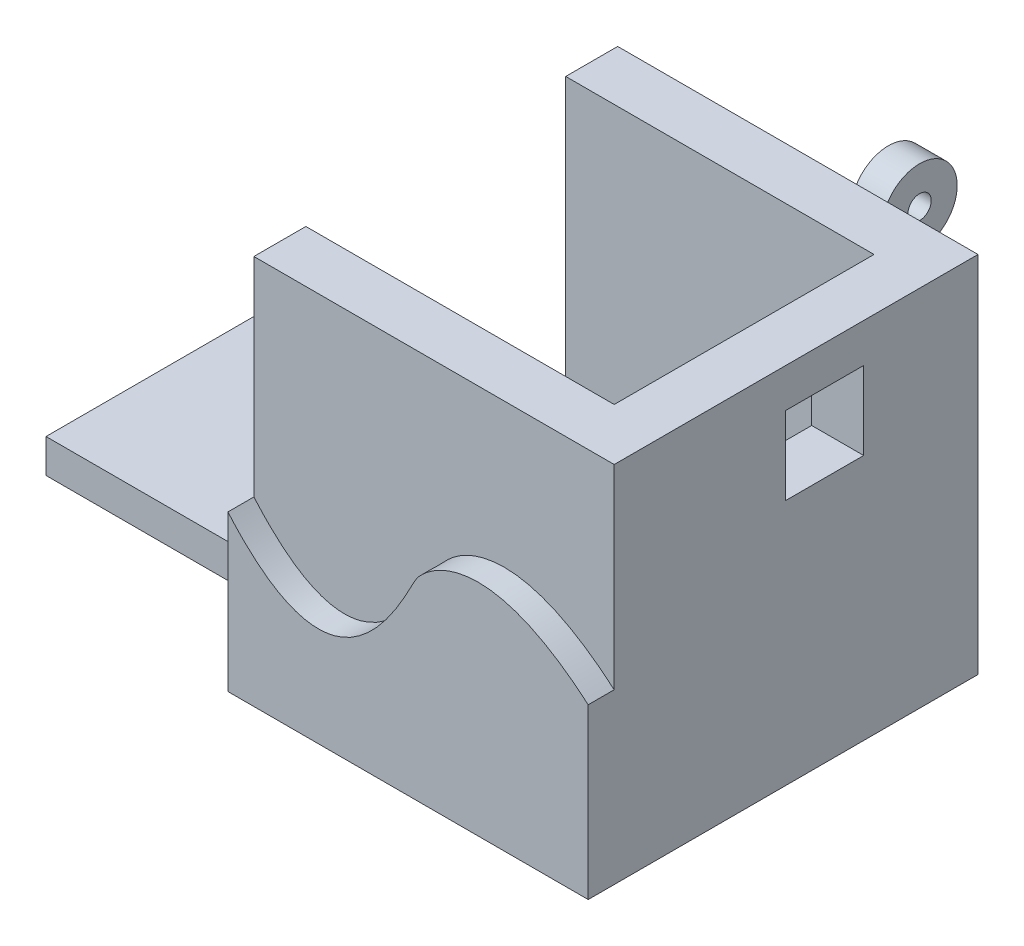
ISO-10303-21;
HEADER;
FILE_DESCRIPTION(('STEP AP214'),'2;1');
FILE_NAME('part.step','',(''),(''),'','','');
FILE_SCHEMA(('AUTOMOTIVE_DESIGN { 1 0 10303 214 1 1 1 1 }'));
ENDSEC;
DATA;
#1=APPLICATION_CONTEXT('core data for automotive mechanical design processes');
#2=APPLICATION_PROTOCOL_DEFINITION('international standard','automotive_design',2000,#1);
#3=PRODUCT_CONTEXT('',#1,'mechanical');
#4=PRODUCT('Part','Part','',(#3));
#5=PRODUCT_RELATED_PRODUCT_CATEGORY('part','',(#4));
#6=PRODUCT_DEFINITION_FORMATION('','',#4);
#7=PRODUCT_DEFINITION_CONTEXT('part definition',#1,'design');
#8=PRODUCT_DEFINITION('design','',#6,#7);
#9=PRODUCT_DEFINITION_SHAPE('','',#8);
#10=(LENGTH_UNIT() NAMED_UNIT(*) SI_UNIT(.MILLI.,.METRE.));
#11=(NAMED_UNIT(*) PLANE_ANGLE_UNIT() SI_UNIT($,.RADIAN.));
#12=(NAMED_UNIT(*) SI_UNIT($,.STERADIAN.) SOLID_ANGLE_UNIT());
#13=UNCERTAINTY_MEASURE_WITH_UNIT(LENGTH_MEASURE(1.E-05),#10,'distance_accuracy_value','');
#14=(GEOMETRIC_REPRESENTATION_CONTEXT(3) GLOBAL_UNCERTAINTY_ASSIGNED_CONTEXT((#13)) GLOBAL_UNIT_ASSIGNED_CONTEXT((#10,
#11,#12)) REPRESENTATION_CONTEXT('',''));
#15=CARTESIAN_POINT('',(0.,0.,0.));
#16=DIRECTION('',(0.,0.,1.));
#17=DIRECTION('',(1.,0.,0.));
#18=AXIS2_PLACEMENT_3D('',#15,#16,#17);
#19=CARTESIAN_POINT('',(-69.33,140.,70.));
#20=DIRECTION('',(0.,0.,-1.));
#21=DIRECTION('',(-1.,0.,0.));
#22=AXIS2_PLACEMENT_3D('',#19,#20,#21);
#23=PLANE('',#22);
#24=CARTESIAN_POINT('',(69.3300000000001,64.9320580308301,70.));
#25=CARTESIAN_POINT('',(32.0758163254666,96.8761575932816,70.));
#26=CARTESIAN_POINT('',(5.66249098280974,78.8870594514356,70.));
#27=CARTESIAN_POINT('',(-7.37035284858875,53.3024772486336,70.));
#28=CARTESIAN_POINT('',(-30.324326288878,14.7238156268719,70.));
#29=CARTESIAN_POINT('',(-69.33,59.86,70.));
#30=B_SPLINE_CURVE_WITH_KNOTS('',3,(#24,#25,#26,#27,#28,#29),.UNSPECIFIED.,.F.,.F.,(4,1,1,4),
(0.,0.200150693882502,0.240865393158399,1.),.UNSPECIFIED.);
#31=CARTESIAN_POINT('',(69.33,64.9320580308301,70.));
#32=VERTEX_POINT('',#31);
#33=CARTESIAN_POINT('',(-69.33,59.86,70.));
#34=VERTEX_POINT('',#33);
#35=EDGE_CURVE('E219',#32,#34,#30,.T.);
#36=ORIENTED_EDGE('',*,*,#35,.F.);
#37=DIRECTION('',(0.,-1.,0.));
#38=VECTOR('',#37,1.);
#39=CARTESIAN_POINT('',(69.33,140.,70.));
#40=LINE('',#39,#38);
#41=CARTESIAN_POINT('',(69.33,140.,70.));
#42=VERTEX_POINT('',#41);
#43=EDGE_CURVE('E435',#42,#32,#40,.T.);
#44=ORIENTED_EDGE('',*,*,#43,.F.);
#45=DIRECTION('',(1.,0.,0.));
#46=VECTOR('',#45,1.);
#47=CARTESIAN_POINT('',(-69.33,140.,70.));
#48=LINE('',#47,#46);
#49=CARTESIAN_POINT('',(-69.33,140.,70.));
#50=VERTEX_POINT('',#49);
#51=EDGE_CURVE('E433',#50,#42,#48,.T.);
#52=ORIENTED_EDGE('',*,*,#51,.F.);
#53=DIRECTION('',(0.,-1.,0.));
#54=VECTOR('',#53,1.);
#55=CARTESIAN_POINT('',(-69.33,140.,70.));
#56=LINE('',#55,#54);
#57=EDGE_CURVE('E442',#50,#34,#56,.T.);
#58=ORIENTED_EDGE('',*,*,#57,.T.);
#59=EDGE_LOOP('',(#36,#44,#52,#58));
#60=FACE_BOUND('',#59,.T.);
#61=ADVANCED_FACE('F39',(#60),#23,.F.);
#62=CARTESIAN_POINT('',(-69.33,140.,-70.));
#63=DIRECTION('',(0.,0.,1.));
#64=DIRECTION('',(1.,0.,0.));
#65=AXIS2_PLACEMENT_3D('',#62,#63,#64);
#66=PLANE('',#65);
#67=DIRECTION('',(-1.,0.,0.));
#68=VECTOR('',#67,1.);
#69=CARTESIAN_POINT('',(-69.33,0.,-70.));
#70=LINE('',#69,#68);
#71=CARTESIAN_POINT('',(69.33,0.,-70.));
#72=VERTEX_POINT('',#71);
#73=CARTESIAN_POINT('',(-69.33,0.,-70.));
#74=VERTEX_POINT('',#73);
#75=EDGE_CURVE('E318',#72,#74,#70,.T.);
#76=ORIENTED_EDGE('',*,*,#75,.T.);
#77=DIRECTION('',(0.,-1.,0.));
#78=VECTOR('',#77,1.);
#79=CARTESIAN_POINT('',(-69.33,140.,-70.));
#80=LINE('',#79,#78);
#81=CARTESIAN_POINT('',(-69.33,140.,-70.));
#82=VERTEX_POINT('',#81);
#83=EDGE_CURVE('E47',#82,#74,#80,.T.);
#84=ORIENTED_EDGE('',*,*,#83,.F.);
#85=DIRECTION('',(-1.,0.,0.));
#86=VECTOR('',#85,1.);
#87=CARTESIAN_POINT('',(-69.33,140.,-70.));
#88=LINE('',#87,#86);
#89=CARTESIAN_POINT('',(69.33,140.,-70.));
#90=VERTEX_POINT('',#89);
#91=EDGE_CURVE('E426',#90,#82,#88,.T.);
#92=ORIENTED_EDGE('',*,*,#91,.F.);
#93=DIRECTION('',(0.,-1.,0.));
#94=VECTOR('',#93,1.);
#95=CARTESIAN_POINT('',(69.33,140.,-70.));
#96=LINE('',#95,#94);
#97=EDGE_CURVE('E12',#90,#72,#96,.T.);
#98=ORIENTED_EDGE('',*,*,#97,.T.);
#99=EDGE_LOOP('',(#76,#84,#92,#98));
#100=FACE_BOUND('',#99,.T.);
#101=DIRECTION('',(1.,0.,0.));
#102=VECTOR('',#101,1.);
#103=CARTESIAN_POINT('',(22.33,139.330471622785,-70.));
#104=LINE('',#103,#102);
#105=CARTESIAN_POINT('',(34.33,139.330471622785,-70.));
#106=VERTEX_POINT('',#105);
#107=CARTESIAN_POINT('',(22.33,139.330471622785,-70.));
#108=VERTEX_POINT('',#107);
#109=EDGE_CURVE('E323',#106,#108,#104,.F.);
#110=ORIENTED_EDGE('',*,*,#109,.T.);
#111=DIRECTION('',(0.,1.,0.));
#112=VECTOR('',#111,1.);
#113=CARTESIAN_POINT('',(22.33,132.,-70.));
#114=LINE('',#113,#112);
#115=CARTESIAN_POINT('',(22.33,120.,-70.));
#116=VERTEX_POINT('',#115);
#117=EDGE_CURVE('E326',#116,#108,#114,.T.);
#118=ORIENTED_EDGE('',*,*,#117,.F.);
#119=DIRECTION('',(-1.,0.,0.));
#120=VECTOR('',#119,1.);
#121=CARTESIAN_POINT('',(34.33,120.,-70.));
#122=LINE('',#121,#120);
#123=CARTESIAN_POINT('',(34.33,120.,-70.));
#124=VERTEX_POINT('',#123);
#125=EDGE_CURVE('E346',#124,#116,#122,.T.);
#126=ORIENTED_EDGE('',*,*,#125,.F.);
#127=DIRECTION('',(0.,-1.,0.));
#128=VECTOR('',#127,1.);
#129=CARTESIAN_POINT('',(34.33,132.,-70.));
#130=LINE('',#129,#128);
#131=EDGE_CURVE('E328',#106,#124,#130,.T.);
#132=ORIENTED_EDGE('',*,*,#131,.F.);
#133=EDGE_LOOP('',(#110,#118,#126,#132));
#134=FACE_BOUND('',#133,.T.);
#135=ADVANCED_FACE('F307',(#100,#134),#66,.F.);
#136=CARTESIAN_POINT('',(-69.33,140.,-70.));
#137=DIRECTION('',(1.,0.,0.));
#138=DIRECTION('',(0.,0.,-1.));
#139=AXIS2_PLACEMENT_3D('',#136,#137,#138);
#140=PLANE('',#139);
#141=DIRECTION('',(0.,0.,1.));
#142=VECTOR('',#141,1.);
#143=CARTESIAN_POINT('',(-69.33,30.,-50.));
#144=LINE('',#143,#142);
#145=CARTESIAN_POINT('',(-69.33,30.,-50.));
#146=VERTEX_POINT('',#145);
#147=CARTESIAN_POINT('',(-69.33,30.,50.));
#148=VERTEX_POINT('',#147);
#149=EDGE_CURVE('E394',#146,#148,#144,.T.);
#150=ORIENTED_EDGE('',*,*,#149,.F.);
#151=DIRECTION('',(0.,1.,0.));
#152=VECTOR('',#151,1.);
#153=CARTESIAN_POINT('',(-69.33,30.,-50.));
#154=LINE('',#153,#152);
#155=CARTESIAN_POINT('',(-69.33,140.,-50.));
#156=VERTEX_POINT('',#155);
#157=EDGE_CURVE('E414',#146,#156,#154,.T.);
#158=ORIENTED_EDGE('',*,*,#157,.T.);
#159=DIRECTION('',(0.,0.,1.));
#160=VECTOR('',#159,1.);
#161=CARTESIAN_POINT('',(-69.33,140.,-70.));
#162=LINE('',#161,#160);
#163=EDGE_CURVE('E430',#82,#156,#162,.T.);
#164=ORIENTED_EDGE('',*,*,#163,.F.);
#165=ORIENTED_EDGE('',*,*,#83,.T.);
#166=DIRECTION('',(0.,0.,1.));
#167=VECTOR('',#166,1.);
#168=CARTESIAN_POINT('',(-69.33,0.,-70.));
#169=LINE('',#168,#167);
#170=CARTESIAN_POINT('',(-69.33,0.,80.));
#171=VERTEX_POINT('',#170);
#172=EDGE_CURVE('E427',#74,#171,#169,.T.);
#173=ORIENTED_EDGE('',*,*,#172,.T.);
#174=DIRECTION('',(0.,-1.,0.));
#175=VECTOR('',#174,1.);
#176=CARTESIAN_POINT('',(-69.33,0.,80.));
#177=LINE('',#176,#175);
#178=CARTESIAN_POINT('',(-69.33,59.86,80.));
#179=VERTEX_POINT('',#178);
#180=EDGE_CURVE('E226',#179,#171,#177,.T.);
#181=ORIENTED_EDGE('',*,*,#180,.F.);
#182=DIRECTION('',(0.,0.,-1.));
#183=VECTOR('',#182,1.);
#184=CARTESIAN_POINT('',(-69.33,59.86,80.));
#185=LINE('',#184,#183);
#186=EDGE_CURVE('E466',#179,#34,#185,.T.);
#187=ORIENTED_EDGE('',*,*,#186,.T.);
#188=ORIENTED_EDGE('',*,*,#57,.F.);
#189=CARTESIAN_POINT('',(-69.33,140.,50.));
#190=VERTEX_POINT('',#189);
#191=EDGE_CURVE('E429',#190,#50,#162,.T.);
#192=ORIENTED_EDGE('',*,*,#191,.F.);
#193=DIRECTION('',(0.,1.,0.));
#194=VECTOR('',#193,1.);
#195=CARTESIAN_POINT('',(-69.33,30.,50.));
#196=LINE('',#195,#194);
#197=EDGE_CURVE('E407',#148,#190,#196,.T.);
#198=ORIENTED_EDGE('',*,*,#197,.F.);
#199=EDGE_LOOP('',(#150,#158,#164,#165,#173,#181,#187,#188,#192,#198));
#200=FACE_BOUND('',#199,.T.);
#201=DIRECTION('',(0.,-1.,0.));
#202=VECTOR('',#201,1.);
#203=CARTESIAN_POINT('',(-69.33,20.,-50.));
#204=LINE('',#203,#202);
#205=CARTESIAN_POINT('',(-69.33,20.,-50.));
#206=VERTEX_POINT('',#205);
#207=CARTESIAN_POINT('',(-69.33,7.00000000000001,-50.));
#208=VERTEX_POINT('',#207);
#209=EDGE_CURVE('E360',#206,#208,#204,.T.);
#210=ORIENTED_EDGE('',*,*,#209,.F.);
#211=DIRECTION('',(0.,0.,-1.));
#212=VECTOR('',#211,1.);
#213=CARTESIAN_POINT('',(-69.33,20.,-50.));
#214=LINE('',#213,#212);
#215=CARTESIAN_POINT('',(-69.33,20.,50.));
#216=VERTEX_POINT('',#215);
#217=EDGE_CURVE('E365',#216,#206,#214,.T.);
#218=ORIENTED_EDGE('',*,*,#217,.F.);
#219=DIRECTION('',(0.,1.,0.));
#220=VECTOR('',#219,1.);
#221=CARTESIAN_POINT('',(-69.33,20.,50.));
#222=LINE('',#221,#220);
#223=CARTESIAN_POINT('',(-69.33,7.00000000000001,50.));
#224=VERTEX_POINT('',#223);
#225=EDGE_CURVE('E377',#224,#216,#222,.T.);
#226=ORIENTED_EDGE('',*,*,#225,.F.);
#227=DIRECTION('',(0.,0.,1.));
#228=VECTOR('',#227,1.);
#229=CARTESIAN_POINT('',(-69.33,7.,-50.));
#230=LINE('',#229,#228);
#231=EDGE_CURVE('E374',#208,#224,#230,.T.);
#232=ORIENTED_EDGE('',*,*,#231,.F.);
#233=EDGE_LOOP('',(#210,#218,#226,#232));
#234=FACE_BOUND('',#233,.T.);
#235=ADVANCED_FACE('F309',(#200,#234),#140,.F.);
#236=CARTESIAN_POINT('',(69.33,140.,-70.));
#237=DIRECTION('',(-1.,0.,0.));
#238=DIRECTION('',(0.,0.,1.));
#239=AXIS2_PLACEMENT_3D('',#236,#237,#238);
#240=PLANE('',#239);
#241=DIRECTION('',(0.,0.,1.));
#242=VECTOR('',#241,1.);
#243=CARTESIAN_POINT('',(69.33,95.,-70.));
#244=LINE('',#243,#242);
#245=CARTESIAN_POINT('',(69.33,95.,-26.));
#246=VERTEX_POINT('',#245);
#247=CARTESIAN_POINT('',(69.33,95.,3.99999999999999));
#248=VERTEX_POINT('',#247);
#249=EDGE_CURVE('E213',#246,#248,#244,.T.);
#250=ORIENTED_EDGE('',*,*,#249,.T.);
#251=DIRECTION('',(0.,1.,0.));
#252=VECTOR('',#251,1.);
#253=CARTESIAN_POINT('',(69.33,140.,3.99999999999999));
#254=LINE('',#253,#252);
#255=CARTESIAN_POINT('',(69.33,125.,3.99999999999999));
#256=VERTEX_POINT('',#255);
#257=EDGE_CURVE('E216',#248,#256,#254,.T.);
#258=ORIENTED_EDGE('',*,*,#257,.T.);
#259=DIRECTION('',(0.,0.,-1.));
#260=VECTOR('',#259,1.);
#261=CARTESIAN_POINT('',(69.33,125.,-70.));
#262=LINE('',#261,#260);
#263=CARTESIAN_POINT('',(69.33,125.,-26.));
#264=VERTEX_POINT('',#263);
#265=EDGE_CURVE('E208',#256,#264,#262,.T.);
#266=ORIENTED_EDGE('',*,*,#265,.T.);
#267=DIRECTION('',(0.,-1.,0.));
#268=VECTOR('',#267,1.);
#269=CARTESIAN_POINT('',(69.33,140.,-26.));
#270=LINE('',#269,#268);
#271=EDGE_CURVE('E188',#264,#246,#270,.T.);
#272=ORIENTED_EDGE('',*,*,#271,.T.);
#273=EDGE_LOOP('',(#250,#258,#266,#272));
#274=FACE_BOUND('',#273,.T.);
#275=DIRECTION('',(0.,0.,-1.));
#276=VECTOR('',#275,1.);
#277=CARTESIAN_POINT('',(69.33,0.,-70.));
#278=LINE('',#277,#276);
#279=CARTESIAN_POINT('',(69.33,0.,80.));
#280=VERTEX_POINT('',#279);
#281=EDGE_CURVE('E417',#280,#72,#278,.T.);
#282=ORIENTED_EDGE('',*,*,#281,.T.);
#283=ORIENTED_EDGE('',*,*,#97,.F.);
#284=DIRECTION('',(0.,0.,-1.));
#285=VECTOR('',#284,1.);
#286=CARTESIAN_POINT('',(69.33,140.,-70.));
#287=LINE('',#286,#285);
#288=EDGE_CURVE('E423',#42,#90,#287,.T.);
#289=ORIENTED_EDGE('',*,*,#288,.F.);
#290=ORIENTED_EDGE('',*,*,#43,.T.);
#291=DIRECTION('',(0.,0.,-1.));
#292=VECTOR('',#291,1.);
#293=CARTESIAN_POINT('',(69.33,64.9320580308302,80.));
#294=LINE('',#293,#292);
#295=CARTESIAN_POINT('',(69.33,64.9320580308302,80.));
#296=VERTEX_POINT('',#295);
#297=EDGE_CURVE('E454',#296,#32,#294,.T.);
#298=ORIENTED_EDGE('',*,*,#297,.F.);
#299=DIRECTION('',(0.,1.,0.));
#300=VECTOR('',#299,1.);
#301=CARTESIAN_POINT('',(69.33,64.9320580308302,80.));
#302=LINE('',#301,#300);
#303=EDGE_CURVE('E453',#280,#296,#302,.T.);
#304=ORIENTED_EDGE('',*,*,#303,.F.);
#305=EDGE_LOOP('',(#282,#283,#289,#290,#298,#304));
#306=FACE_BOUND('',#305,.T.);
#307=ADVANCED_FACE('F41',(#274,#306),#240,.F.);
#308=CARTESIAN_POINT('',(0.,140.,0.));
#309=DIRECTION('',(0.,1.,0.));
#310=DIRECTION('',(0.,0.,1.));
#311=AXIS2_PLACEMENT_3D('',#308,#309,#310);
#312=PLANE('',#311);
#313=DIRECTION('',(-1.,0.,0.));
#314=VECTOR('',#313,1.);
#315=CARTESIAN_POINT('',(-69.33,140.,-50.));
#316=LINE('',#315,#314);
#317=CARTESIAN_POINT('',(49.33,140.,-50.));
#318=VERTEX_POINT('',#317);
#319=EDGE_CURVE('E398',#318,#156,#316,.T.);
#320=ORIENTED_EDGE('',*,*,#319,.F.);
#321=DIRECTION('',(0.,0.,-1.));
#322=VECTOR('',#321,1.);
#323=CARTESIAN_POINT('',(49.33,140.,-50.));
#324=LINE('',#323,#322);
#325=CARTESIAN_POINT('',(49.33,140.,50.));
#326=VERTEX_POINT('',#325);
#327=EDGE_CURVE('E410',#326,#318,#324,.T.);
#328=ORIENTED_EDGE('',*,*,#327,.F.);
#329=DIRECTION('',(1.,0.,0.));
#330=VECTOR('',#329,1.);
#331=CARTESIAN_POINT('',(-69.33,140.,50.));
#332=LINE('',#331,#330);
#333=EDGE_CURVE('E393',#190,#326,#332,.T.);
#334=ORIENTED_EDGE('',*,*,#333,.F.);
#335=ORIENTED_EDGE('',*,*,#191,.T.);
#336=ORIENTED_EDGE('',*,*,#51,.T.);
#337=ORIENTED_EDGE('',*,*,#288,.T.);
#338=ORIENTED_EDGE('',*,*,#91,.T.);
#339=ORIENTED_EDGE('',*,*,#163,.T.);
#340=EDGE_LOOP('',(#320,#328,#334,#335,#336,#337,#338,#339));
#341=FACE_BOUND('',#340,.T.);
#342=ADVANCED_FACE('F298',(#341),#312,.T.);
#343=CARTESIAN_POINT('',(0.,0.,0.));
#344=DIRECTION('',(0.,1.,0.));
#345=DIRECTION('',(0.,0.,1.));
#346=AXIS2_PLACEMENT_3D('',#343,#344,#345);
#347=PLANE('',#346);
#348=ORIENTED_EDGE('',*,*,#281,.F.);
#349=DIRECTION('',(1.,0.,0.));
#350=VECTOR('',#349,1.);
#351=CARTESIAN_POINT('',(69.33,0.,80.));
#352=LINE('',#351,#350);
#353=EDGE_CURVE('E450',#171,#280,#352,.T.);
#354=ORIENTED_EDGE('',*,*,#353,.F.);
#355=ORIENTED_EDGE('',*,*,#172,.F.);
#356=ORIENTED_EDGE('',*,*,#75,.F.);
#357=EDGE_LOOP('',(#348,#354,#355,#356));
#358=FACE_BOUND('',#357,.T.);
#359=ADVANCED_FACE('F291',(#358),#347,.F.);
#360=CARTESIAN_POINT('',(-69.33,30.,-50.));
#361=DIRECTION('',(0.,0.,-1.));
#362=DIRECTION('',(-1.,0.,0.));
#363=AXIS2_PLACEMENT_3D('',#360,#361,#362);
#364=PLANE('',#363);
#365=ORIENTED_EDGE('',*,*,#319,.T.);
#366=ORIENTED_EDGE('',*,*,#157,.F.);
#367=DIRECTION('',(-1.,0.,0.));
#368=VECTOR('',#367,1.);
#369=CARTESIAN_POINT('',(-69.33,30.,-50.));
#370=LINE('',#369,#368);
#371=CARTESIAN_POINT('',(49.33,30.,-50.));
#372=VERTEX_POINT('',#371);
#373=EDGE_CURVE('E404',#372,#146,#370,.T.);
#374=ORIENTED_EDGE('',*,*,#373,.F.);
#375=DIRECTION('',(0.,1.,0.));
#376=VECTOR('',#375,1.);
#377=CARTESIAN_POINT('',(49.33,30.,-50.));
#378=LINE('',#377,#376);
#379=EDGE_CURVE('E418',#372,#318,#378,.T.);
#380=ORIENTED_EDGE('',*,*,#379,.T.);
#381=EDGE_LOOP('',(#365,#366,#374,#380));
#382=FACE_BOUND('',#381,.T.);
#383=ADVANCED_FACE('F288',(#382),#364,.F.);
#384=CARTESIAN_POINT('',(49.33,30.,-50.));
#385=DIRECTION('',(1.,0.,0.));
#386=DIRECTION('',(0.,0.,-1.));
#387=AXIS2_PLACEMENT_3D('',#384,#385,#386);
#388=PLANE('',#387);
#389=DIRECTION('',(0.,0.,-1.));
#390=VECTOR('',#389,1.);
#391=CARTESIAN_POINT('',(49.33,125.,3.99999999999999));
#392=LINE('',#391,#390);
#393=CARTESIAN_POINT('',(49.33,125.,3.99999999999999));
#394=VERTEX_POINT('',#393);
#395=CARTESIAN_POINT('',(49.33,125.,-26.));
#396=VERTEX_POINT('',#395);
#397=EDGE_CURVE('E194',#394,#396,#392,.T.);
#398=ORIENTED_EDGE('',*,*,#397,.F.);
#399=DIRECTION('',(0.,1.,0.));
#400=VECTOR('',#399,1.);
#401=CARTESIAN_POINT('',(49.33,95.,3.99999999999999));
#402=LINE('',#401,#400);
#403=CARTESIAN_POINT('',(49.33,95.,3.99999999999999));
#404=VERTEX_POINT('',#403);
#405=EDGE_CURVE('E62',#404,#394,#402,.T.);
#406=ORIENTED_EDGE('',*,*,#405,.F.);
#407=DIRECTION('',(0.,0.,1.));
#408=VECTOR('',#407,1.);
#409=CARTESIAN_POINT('',(49.33,95.,3.99999999999999));
#410=LINE('',#409,#408);
#411=CARTESIAN_POINT('',(49.33,95.,-26.));
#412=VERTEX_POINT('',#411);
#413=EDGE_CURVE('E201',#412,#404,#410,.T.);
#414=ORIENTED_EDGE('',*,*,#413,.F.);
#415=DIRECTION('',(0.,-1.,0.));
#416=VECTOR('',#415,1.);
#417=CARTESIAN_POINT('',(49.33,95.,-26.));
#418=LINE('',#417,#416);
#419=EDGE_CURVE('E185',#396,#412,#418,.T.);
#420=ORIENTED_EDGE('',*,*,#419,.F.);
#421=EDGE_LOOP('',(#398,#406,#414,#420));
#422=FACE_BOUND('',#421,.T.);
#423=ORIENTED_EDGE('',*,*,#327,.T.);
#424=ORIENTED_EDGE('',*,*,#379,.F.);
#425=DIRECTION('',(0.,0.,-1.));
#426=VECTOR('',#425,1.);
#427=CARTESIAN_POINT('',(49.33,30.,-50.));
#428=LINE('',#427,#426);
#429=CARTESIAN_POINT('',(49.33,30.,50.));
#430=VERTEX_POINT('',#429);
#431=EDGE_CURVE('E401',#430,#372,#428,.T.);
#432=ORIENTED_EDGE('',*,*,#431,.F.);
#433=DIRECTION('',(0.,1.,0.));
#434=VECTOR('',#433,1.);
#435=CARTESIAN_POINT('',(49.33,30.,50.));
#436=LINE('',#435,#434);
#437=EDGE_CURVE('E420',#430,#326,#436,.T.);
#438=ORIENTED_EDGE('',*,*,#437,.T.);
#439=EDGE_LOOP('',(#423,#424,#432,#438));
#440=FACE_BOUND('',#439,.T.);
#441=ADVANCED_FACE('F198',(#422,#440),#388,.F.);
#442=CARTESIAN_POINT('',(-69.33,30.,50.));
#443=DIRECTION('',(0.,0.,1.));
#444=DIRECTION('',(1.,0.,0.));
#445=AXIS2_PLACEMENT_3D('',#442,#443,#444);
#446=PLANE('',#445);
#447=ORIENTED_EDGE('',*,*,#333,.T.);
#448=ORIENTED_EDGE('',*,*,#437,.F.);
#449=DIRECTION('',(1.,0.,0.));
#450=VECTOR('',#449,1.);
#451=CARTESIAN_POINT('',(-69.33,30.,50.));
#452=LINE('',#451,#450);
#453=EDGE_CURVE('E397',#148,#430,#452,.T.);
#454=ORIENTED_EDGE('',*,*,#453,.F.);
#455=ORIENTED_EDGE('',*,*,#197,.T.);
#456=EDGE_LOOP('',(#447,#448,#454,#455));
#457=FACE_BOUND('',#456,.T.);
#458=ADVANCED_FACE('F286',(#457),#446,.F.);
#459=CARTESIAN_POINT('',(0.,30.,0.));
#460=DIRECTION('',(0.,1.,0.));
#461=DIRECTION('',(0.,0.,1.));
#462=AXIS2_PLACEMENT_3D('',#459,#460,#461);
#463=PLANE('',#462);
#464=ORIENTED_EDGE('',*,*,#149,.T.);
#465=ORIENTED_EDGE('',*,*,#453,.T.);
#466=ORIENTED_EDGE('',*,*,#431,.T.);
#467=ORIENTED_EDGE('',*,*,#373,.T.);
#468=EDGE_LOOP('',(#464,#465,#466,#467));
#469=FACE_BOUND('',#468,.T.);
#470=ADVANCED_FACE('F282',(#469),#463,.T.);
#471=CARTESIAN_POINT('',(-169.33,20.,-50.));
#472=DIRECTION('',(0.,0.,1.));
#473=DIRECTION('',(1.,0.,0.));
#474=AXIS2_PLACEMENT_3D('',#471,#472,#473);
#475=PLANE('',#474);
#476=ORIENTED_EDGE('',*,*,#209,.T.);
#477=DIRECTION('',(1.,0.,0.));
#478=VECTOR('',#477,1.);
#479=CARTESIAN_POINT('',(-169.33,7.,-50.));
#480=LINE('',#479,#478);
#481=CARTESIAN_POINT('',(-169.33,7.,-50.));
#482=VERTEX_POINT('',#481);
#483=EDGE_CURVE('E390',#482,#208,#480,.T.);
#484=ORIENTED_EDGE('',*,*,#483,.F.);
#485=DIRECTION('',(0.,-1.,0.));
#486=VECTOR('',#485,1.);
#487=CARTESIAN_POINT('',(-169.33,20.,-50.));
#488=LINE('',#487,#486);
#489=CARTESIAN_POINT('',(-169.33,20.,-50.));
#490=VERTEX_POINT('',#489);
#491=EDGE_CURVE('E361',#490,#482,#488,.T.);
#492=ORIENTED_EDGE('',*,*,#491,.F.);
#493=DIRECTION('',(1.,0.,0.));
#494=VECTOR('',#493,1.);
#495=CARTESIAN_POINT('',(-169.33,20.,-50.));
#496=LINE('',#495,#494);
#497=EDGE_CURVE('E371',#490,#206,#496,.T.);
#498=ORIENTED_EDGE('',*,*,#497,.T.);
#499=EDGE_LOOP('',(#476,#484,#492,#498));
#500=FACE_BOUND('',#499,.T.);
#501=ADVANCED_FACE('F278',(#500),#475,.F.);
#502=CARTESIAN_POINT('',(-169.33,7.,-50.));
#503=DIRECTION('',(0.,1.,0.));
#504=DIRECTION('',(0.,0.,1.));
#505=AXIS2_PLACEMENT_3D('',#502,#503,#504);
#506=PLANE('',#505);
#507=CARTESIAN_POINT('',(-89.33,7.,0.));
#508=DIRECTION('',(0.,1.,0.));
#509=DIRECTION('',(0.,0.,1.));
#510=AXIS2_PLACEMENT_3D('',#507,#508,#509);
#511=CIRCLE('',#510,3.00000000000001);
#512=CARTESIAN_POINT('',(-89.33,7.,3.00000000000001));
#513=VERTEX_POINT('',#512);
#514=EDGE_CURVE('E357',#513,#513,#511,.T.);
#515=ORIENTED_EDGE('',*,*,#514,.T.);
#516=EDGE_LOOP('',(#515));
#517=FACE_BOUND('',#516,.T.);
#518=ORIENTED_EDGE('',*,*,#231,.T.);
#519=DIRECTION('',(1.,0.,0.));
#520=VECTOR('',#519,1.);
#521=CARTESIAN_POINT('',(-169.33,7.,50.));
#522=LINE('',#521,#520);
#523=CARTESIAN_POINT('',(-169.33,7.,50.));
#524=VERTEX_POINT('',#523);
#525=EDGE_CURVE('E387',#524,#224,#522,.T.);
#526=ORIENTED_EDGE('',*,*,#525,.F.);
#527=DIRECTION('',(0.,0.,1.));
#528=VECTOR('',#527,1.);
#529=CARTESIAN_POINT('',(-169.33,7.,-50.));
#530=LINE('',#529,#528);
#531=EDGE_CURVE('E364',#482,#524,#530,.T.);
#532=ORIENTED_EDGE('',*,*,#531,.F.);
#533=ORIENTED_EDGE('',*,*,#483,.T.);
#534=EDGE_LOOP('',(#518,#526,#532,#533));
#535=FACE_BOUND('',#534,.T.);
#536=ADVANCED_FACE('F274',(#517,#535),#506,.F.);
#537=CARTESIAN_POINT('',(-169.33,20.,50.));
#538=DIRECTION('',(0.,0.,-1.));
#539=DIRECTION('',(-1.,0.,0.));
#540=AXIS2_PLACEMENT_3D('',#537,#538,#539);
#541=PLANE('',#540);
#542=ORIENTED_EDGE('',*,*,#225,.T.);
#543=DIRECTION('',(1.,0.,0.));
#544=VECTOR('',#543,1.);
#545=CARTESIAN_POINT('',(-169.33,20.,50.));
#546=LINE('',#545,#544);
#547=CARTESIAN_POINT('',(-169.33,20.,50.));
#548=VERTEX_POINT('',#547);
#549=EDGE_CURVE('E384',#548,#216,#546,.T.);
#550=ORIENTED_EDGE('',*,*,#549,.F.);
#551=DIRECTION('',(0.,1.,0.));
#552=VECTOR('',#551,1.);
#553=CARTESIAN_POINT('',(-169.33,20.,50.));
#554=LINE('',#553,#552);
#555=EDGE_CURVE('E367',#524,#548,#554,.T.);
#556=ORIENTED_EDGE('',*,*,#555,.F.);
#557=ORIENTED_EDGE('',*,*,#525,.T.);
#558=EDGE_LOOP('',(#542,#550,#556,#557));
#559=FACE_BOUND('',#558,.T.);
#560=ADVANCED_FACE('F270',(#559),#541,.F.);
#561=CARTESIAN_POINT('',(-169.33,20.,-50.));
#562=DIRECTION('',(0.,-1.,0.));
#563=DIRECTION('',(0.,0.,-1.));
#564=AXIS2_PLACEMENT_3D('',#561,#562,#563);
#565=PLANE('',#564);
#566=CARTESIAN_POINT('',(-89.33,20.,0.));
#567=DIRECTION('',(0.,1.,0.));
#568=DIRECTION('',(0.,0.,1.));
#569=AXIS2_PLACEMENT_3D('',#566,#567,#568);
#570=CIRCLE('',#569,3.00000000000001);
#571=CARTESIAN_POINT('',(-89.33,20.,3.00000000000001));
#572=VERTEX_POINT('',#571);
#573=EDGE_CURVE('E354',#572,#572,#570,.T.);
#574=ORIENTED_EDGE('',*,*,#573,.F.);
#575=EDGE_LOOP('',(#574));
#576=FACE_BOUND('',#575,.T.);
#577=ORIENTED_EDGE('',*,*,#217,.T.);
#578=ORIENTED_EDGE('',*,*,#497,.F.);
#579=DIRECTION('',(0.,0.,-1.));
#580=VECTOR('',#579,1.);
#581=CARTESIAN_POINT('',(-169.33,20.,-50.));
#582=LINE('',#581,#580);
#583=EDGE_CURVE('E369',#548,#490,#582,.T.);
#584=ORIENTED_EDGE('',*,*,#583,.F.);
#585=ORIENTED_EDGE('',*,*,#549,.T.);
#586=EDGE_LOOP('',(#577,#578,#584,#585));
#587=FACE_BOUND('',#586,.T.);
#588=ADVANCED_FACE('F266',(#576,#587),#565,.F.);
#589=CARTESIAN_POINT('',(-169.33,0.,0.));
#590=DIRECTION('',(-1.,0.,0.));
#591=DIRECTION('',(0.,0.,1.));
#592=AXIS2_PLACEMENT_3D('',#589,#590,#591);
#593=PLANE('',#592);
#594=ORIENTED_EDGE('',*,*,#491,.T.);
#595=ORIENTED_EDGE('',*,*,#531,.T.);
#596=ORIENTED_EDGE('',*,*,#555,.T.);
#597=ORIENTED_EDGE('',*,*,#583,.T.);
#598=EDGE_LOOP('',(#594,#595,#596,#597));
#599=FACE_BOUND('',#598,.T.);
#600=ADVANCED_FACE('F262',(#599),#593,.T.);
#601=CARTESIAN_POINT('',(-89.33,0.,0.));
#602=DIRECTION('',(0.,1.,0.));
#603=DIRECTION('',(0.,0.,1.));
#604=AXIS2_PLACEMENT_3D('',#601,#602,#603);
#605=CYLINDRICAL_SURFACE('',#604,3.00000000000001);
#606=ORIENTED_EDGE('',*,*,#573,.T.);
#607=EDGE_LOOP('',(#606));
#608=FACE_BOUND('',#607,.T.);
#609=ORIENTED_EDGE('',*,*,#514,.F.);
#610=EDGE_LOOP('',(#609));
#611=FACE_BOUND('',#610,.T.);
#612=ADVANCED_FACE('F258',(#608,#611),#605,.F.);
#613=CARTESIAN_POINT('',(34.33,132.,-80.));
#614=DIRECTION('',(-1.,0.,0.));
#615=DIRECTION('',(0.,0.,1.));
#616=AXIS2_PLACEMENT_3D('',#613,#614,#615);
#617=PLANE('',#616);
#618=DIRECTION('',(0.,0.,1.));
#619=VECTOR('',#618,1.);
#620=CARTESIAN_POINT('',(34.33,120.,-80.));
#621=LINE('',#620,#619);
#622=CARTESIAN_POINT('',(34.33,120.,-74.3768347171525));
#623=VERTEX_POINT('',#622);
#624=EDGE_CURVE('E351',#623,#124,#621,.T.);
#625=ORIENTED_EDGE('',*,*,#624,.F.);
#626=CARTESIAN_POINT('',(34.33,132.,-82.5));
#627=DIRECTION('',(1.,0.,0.));
#628=DIRECTION('',(0.,0.,-1.));
#629=AXIS2_PLACEMENT_3D('',#626,#627,#628);
#630=CIRCLE('',#629,14.4908872817526);
#631=EDGE_CURVE('E336',#623,#106,#630,.T.);
#632=ORIENTED_EDGE('',*,*,#631,.T.);
#633=ORIENTED_EDGE('',*,*,#131,.T.);
#634=EDGE_LOOP('',(#625,#632,#633));
#635=FACE_BOUND('',#634,.T.);
#636=CARTESIAN_POINT('',(34.33,132.,-82.5));
#637=DIRECTION('',(1.,0.,0.));
#638=DIRECTION('',(0.,0.,-1.));
#639=AXIS2_PLACEMENT_3D('',#636,#637,#638);
#640=CIRCLE('',#639,4.4908872817526);
#641=CARTESIAN_POINT('',(34.33,132.,-86.9908872817526));
#642=VERTEX_POINT('',#641);
#643=EDGE_CURVE('E342',#642,#642,#640,.T.);
#644=ORIENTED_EDGE('',*,*,#643,.F.);
#645=EDGE_LOOP('',(#644));
#646=FACE_BOUND('',#645,.T.);
#647=ADVANCED_FACE('F254',(#635,#646),#617,.F.);
#648=CARTESIAN_POINT('',(34.33,120.,-80.));
#649=DIRECTION('',(0.,1.,0.));
#650=DIRECTION('',(0.,0.,1.));
#651=AXIS2_PLACEMENT_3D('',#648,#649,#650);
#652=PLANE('',#651);
#653=DIRECTION('',(0.,0.,1.));
#654=VECTOR('',#653,1.);
#655=CARTESIAN_POINT('',(22.33,120.,-80.));
#656=LINE('',#655,#654);
#657=CARTESIAN_POINT('',(22.33,120.,-74.3768347171525));
#658=VERTEX_POINT('',#657);
#659=EDGE_CURVE('E349',#658,#116,#656,.T.);
#660=ORIENTED_EDGE('',*,*,#659,.F.);
#661=DIRECTION('',(1.,0.,0.));
#662=VECTOR('',#661,1.);
#663=CARTESIAN_POINT('',(22.33,120.,-74.3768347171525));
#664=LINE('',#663,#662);
#665=EDGE_CURVE('E330',#658,#623,#664,.T.);
#666=ORIENTED_EDGE('',*,*,#665,.T.);
#667=ORIENTED_EDGE('',*,*,#624,.T.);
#668=ORIENTED_EDGE('',*,*,#125,.T.);
#669=EDGE_LOOP('',(#660,#666,#667,#668));
#670=FACE_BOUND('',#669,.T.);
#671=ADVANCED_FACE('F250',(#670),#652,.F.);
#672=CARTESIAN_POINT('',(22.33,132.,-80.));
#673=DIRECTION('',(1.,0.,0.));
#674=DIRECTION('',(0.,1.,0.));
#675=AXIS2_PLACEMENT_3D('',#672,#673,#674);
#676=PLANE('',#675);
#677=CARTESIAN_POINT('',(22.33,132.,-82.5));
#678=DIRECTION('',(1.,0.,0.));
#679=DIRECTION('',(0.,0.,-1.));
#680=AXIS2_PLACEMENT_3D('',#677,#678,#679);
#681=CIRCLE('',#680,14.4908872817526);
#682=EDGE_CURVE('E333',#658,#108,#681,.T.);
#683=ORIENTED_EDGE('',*,*,#682,.F.);
#684=ORIENTED_EDGE('',*,*,#659,.T.);
#685=ORIENTED_EDGE('',*,*,#117,.T.);
#686=EDGE_LOOP('',(#683,#684,#685));
#687=FACE_BOUND('',#686,.T.);
#688=CARTESIAN_POINT('',(22.33,132.,-82.5));
#689=DIRECTION('',(1.,0.,0.));
#690=DIRECTION('',(0.,0.,-1.));
#691=AXIS2_PLACEMENT_3D('',#688,#689,#690);
#692=CIRCLE('',#691,4.4908872817526);
#693=CARTESIAN_POINT('',(22.33,132.,-86.9908872817526));
#694=VERTEX_POINT('',#693);
#695=EDGE_CURVE('E339',#694,#694,#692,.T.);
#696=ORIENTED_EDGE('',*,*,#695,.T.);
#697=EDGE_LOOP('',(#696));
#698=FACE_BOUND('',#697,.T.);
#699=ADVANCED_FACE('F246',(#687,#698),#676,.F.);
#700=CARTESIAN_POINT('',(22.33,132.,-82.5));
#701=DIRECTION('',(1.,0.,0.));
#702=DIRECTION('',(0.,0.,-1.));
#703=AXIS2_PLACEMENT_3D('',#700,#701,#702);
#704=CYLINDRICAL_SURFACE('',#703,14.4908872817526);
#705=ORIENTED_EDGE('',*,*,#109,.F.);
#706=ORIENTED_EDGE('',*,*,#631,.F.);
#707=ORIENTED_EDGE('',*,*,#665,.F.);
#708=ORIENTED_EDGE('',*,*,#682,.T.);
#709=EDGE_LOOP('',(#705,#706,#707,#708));
#710=FACE_BOUND('',#709,.T.);
#711=ADVANCED_FACE('F242',(#710),#704,.T.);
#712=CARTESIAN_POINT('',(22.33,132.,-82.5));
#713=DIRECTION('',(1.,0.,0.));
#714=DIRECTION('',(0.,0.,-1.));
#715=AXIS2_PLACEMENT_3D('',#712,#713,#714);
#716=CYLINDRICAL_SURFACE('',#715,4.4908872817526);
#717=ORIENTED_EDGE('',*,*,#695,.F.);
#718=EDGE_LOOP('',(#717));
#719=FACE_BOUND('',#718,.T.);
#720=ORIENTED_EDGE('',*,*,#643,.T.);
#721=EDGE_LOOP('',(#720));
#722=FACE_BOUND('',#721,.T.);
#723=ADVANCED_FACE('F237',(#719,#722),#716,.F.);
#724=CARTESIAN_POINT('',(69.3300000000001,64.9320580308301,80.));
#725=CARTESIAN_POINT('',(32.0758163254666,96.8761575932816,80.));
#726=CARTESIAN_POINT('',(5.66249098280974,78.8870594514356,80.));
#727=CARTESIAN_POINT('',(-7.37035284858875,53.3024772486336,80.));
#728=CARTESIAN_POINT('',(-30.324326288878,14.7238156268719,80.));
#729=CARTESIAN_POINT('',(-69.33,59.86,80.));
#730=B_SPLINE_CURVE_WITH_KNOTS('',3,(#724,#725,#726,#727,#728,#729),.UNSPECIFIED.,.F.,.F.,(4,1,
1,4),(0.,0.200150693882502,0.240865393158399,1.),.UNSPECIFIED.);
#731=DIRECTION('',(0.,0.,-1.));
#732=VECTOR('',#731,1.);
#733=SURFACE_OF_LINEAR_EXTRUSION('',#730,#732);
#734=ORIENTED_EDGE('',*,*,#35,.T.);
#735=ORIENTED_EDGE('',*,*,#186,.F.);
#736=EDGE_CURVE('E220',#296,#179,#730,.T.);
#737=ORIENTED_EDGE('',*,*,#736,.F.);
#738=ORIENTED_EDGE('',*,*,#297,.T.);
#739=EDGE_LOOP('',(#734,#735,#737,#738));
#740=FACE_BOUND('',#739,.T.);
#741=ADVANCED_FACE('F232',(#740),#733,.F.);
#742=CARTESIAN_POINT('',(-12.9728965378791,49.0468611929678,80.));
#743=DIRECTION('',(0.,0.,-1.));
#744=DIRECTION('',(-1.,0.,0.));
#745=AXIS2_PLACEMENT_3D('',#742,#743,#744);
#746=PLANE('',#745);
#747=ORIENTED_EDGE('',*,*,#736,.T.);
#748=ORIENTED_EDGE('',*,*,#180,.T.);
#749=ORIENTED_EDGE('',*,*,#353,.T.);
#750=ORIENTED_EDGE('',*,*,#303,.T.);
#751=EDGE_LOOP('',(#747,#748,#749,#750));
#752=FACE_BOUND('',#751,.T.);
#753=ADVANCED_FACE('F236',(#752),#746,.F.);
#754=CARTESIAN_POINT('',(89.33,95.,3.99999999999998));
#755=DIRECTION('',(0.,0.,1.));
#756=DIRECTION('',(1.,0.,0.));
#757=AXIS2_PLACEMENT_3D('',#754,#755,#756);
#758=PLANE('',#757);
#759=DIRECTION('',(-1.,0.,0.));
#760=VECTOR('',#759,1.);
#761=CARTESIAN_POINT('',(89.33,95.,3.99999999999998));
#762=LINE('',#761,#760);
#763=EDGE_CURVE('E206',#248,#404,#762,.T.);
#764=ORIENTED_EDGE('',*,*,#763,.T.);
#765=ORIENTED_EDGE('',*,*,#405,.T.);
#766=DIRECTION('',(-1.,0.,0.));
#767=VECTOR('',#766,1.);
#768=CARTESIAN_POINT('',(89.33,125.,3.99999999999998));
#769=LINE('',#768,#767);
#770=EDGE_CURVE('E191',#256,#394,#769,.T.);
#771=ORIENTED_EDGE('',*,*,#770,.F.);
#772=ORIENTED_EDGE('',*,*,#257,.F.);
#773=EDGE_LOOP('',(#764,#765,#771,#772));
#774=FACE_BOUND('',#773,.T.);
#775=ADVANCED_FACE('F492',(#774),#758,.F.);
#776=CARTESIAN_POINT('',(89.33,95.,3.99999999999998));
#777=DIRECTION('',(0.,-1.,0.));
#778=DIRECTION('',(0.,0.,-1.));
#779=AXIS2_PLACEMENT_3D('',#776,#777,#778);
#780=PLANE('',#779);
#781=DIRECTION('',(-1.,0.,0.));
#782=VECTOR('',#781,1.);
#783=CARTESIAN_POINT('',(89.33,95.,-26.));
#784=LINE('',#783,#782);
#785=EDGE_CURVE('E190',#246,#412,#784,.T.);
#786=ORIENTED_EDGE('',*,*,#785,.T.);
#787=ORIENTED_EDGE('',*,*,#413,.T.);
#788=ORIENTED_EDGE('',*,*,#763,.F.);
#789=ORIENTED_EDGE('',*,*,#249,.F.);
#790=EDGE_LOOP('',(#786,#787,#788,#789));
#791=FACE_BOUND('',#790,.T.);
#792=ADVANCED_FACE('F496',(#791),#780,.F.);
#793=CARTESIAN_POINT('',(89.33,95.,-26.));
#794=DIRECTION('',(0.,0.,-1.));
#795=DIRECTION('',(-1.,0.,0.));
#796=AXIS2_PLACEMENT_3D('',#793,#794,#795);
#797=PLANE('',#796);
#798=DIRECTION('',(-1.,0.,0.));
#799=VECTOR('',#798,1.);
#800=CARTESIAN_POINT('',(89.33,125.,-26.));
#801=LINE('',#800,#799);
#802=EDGE_CURVE('E54',#264,#396,#801,.T.);
#803=ORIENTED_EDGE('',*,*,#802,.T.);
#804=ORIENTED_EDGE('',*,*,#419,.T.);
#805=ORIENTED_EDGE('',*,*,#785,.F.);
#806=ORIENTED_EDGE('',*,*,#271,.F.);
#807=EDGE_LOOP('',(#803,#804,#805,#806));
#808=FACE_BOUND('',#807,.T.);
#809=ADVANCED_FACE('F182',(#808),#797,.F.);
#810=CARTESIAN_POINT('',(89.33,125.,3.99999999999998));
#811=DIRECTION('',(0.,1.,0.));
#812=DIRECTION('',(0.,0.,1.));
#813=AXIS2_PLACEMENT_3D('',#810,#811,#812);
#814=PLANE('',#813);
#815=ORIENTED_EDGE('',*,*,#770,.T.);
#816=ORIENTED_EDGE('',*,*,#397,.T.);
#817=ORIENTED_EDGE('',*,*,#802,.F.);
#818=ORIENTED_EDGE('',*,*,#265,.F.);
#819=EDGE_LOOP('',(#815,#816,#817,#818));
#820=FACE_BOUND('',#819,.T.);
#821=ADVANCED_FACE('F195',(#820),#814,.F.);
#822=CLOSED_SHELL('',(#61,#135,#235,#307,#342,#359,#383,#441,#458,#470,#501,#536,#560,#588,#600,
#612,#647,#671,#699,#711,#723,#741,#753,#775,#792,#809,#821));
#823=MANIFOLD_SOLID_BREP('B2',#822);
#824=ADVANCED_BREP_SHAPE_REPRESENTATION('',(#18,#823),#14);
#825=SHAPE_DEFINITION_REPRESENTATION(#9,#824);
ENDSEC;
END-ISO-10303-21;
